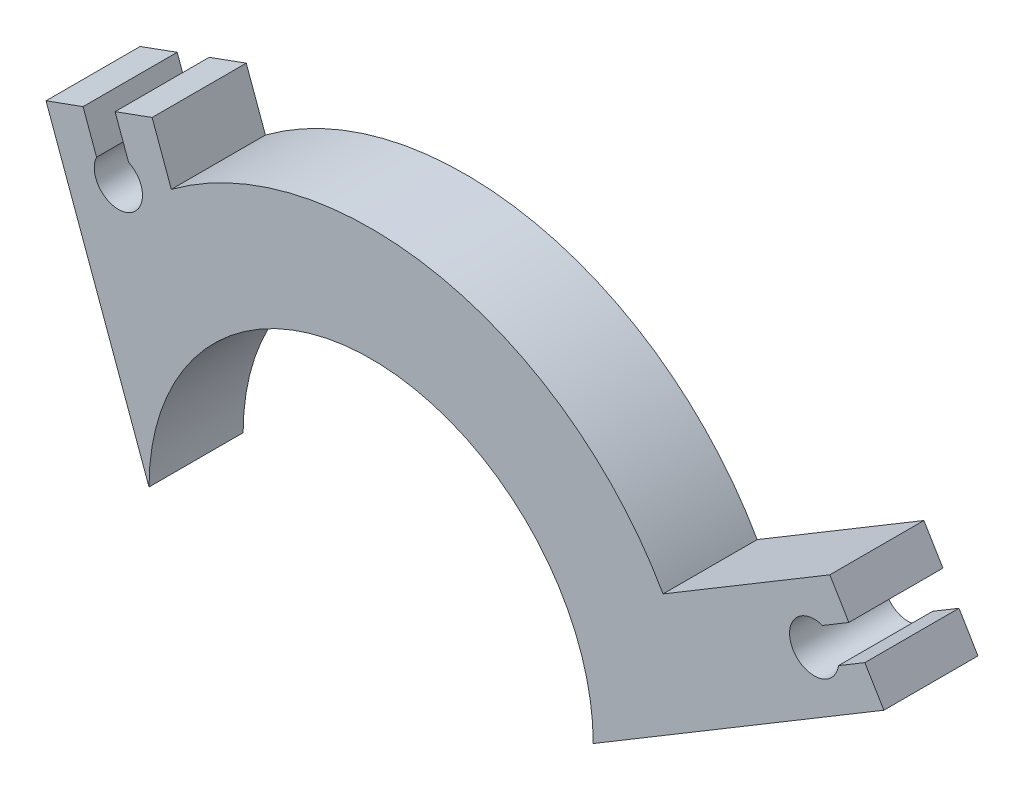
ISO-10303-21;
HEADER;
FILE_DESCRIPTION(('STEP AP214'),'2;1');
FILE_NAME('part.step','',(''),(''),'','','');
FILE_SCHEMA(('AUTOMOTIVE_DESIGN { 1 0 10303 214 1 1 1 1 }'));
ENDSEC;
DATA;
#1=APPLICATION_CONTEXT('core data for automotive mechanical design processes');
#2=APPLICATION_PROTOCOL_DEFINITION('international standard','automotive_design',2000,#1);
#3=PRODUCT_CONTEXT('',#1,'mechanical');
#4=PRODUCT('Part','Part','',(#3));
#5=PRODUCT_RELATED_PRODUCT_CATEGORY('part','',(#4));
#6=PRODUCT_DEFINITION_FORMATION('','',#4);
#7=PRODUCT_DEFINITION_CONTEXT('part definition',#1,'design');
#8=PRODUCT_DEFINITION('design','',#6,#7);
#9=PRODUCT_DEFINITION_SHAPE('','',#8);
#10=(LENGTH_UNIT() NAMED_UNIT(*) SI_UNIT(.MILLI.,.METRE.));
#11=(NAMED_UNIT(*) PLANE_ANGLE_UNIT() SI_UNIT($,.RADIAN.));
#12=(NAMED_UNIT(*) SI_UNIT($,.STERADIAN.) SOLID_ANGLE_UNIT());
#13=UNCERTAINTY_MEASURE_WITH_UNIT(LENGTH_MEASURE(1.E-05),#10,'distance_accuracy_value','');
#14=(GEOMETRIC_REPRESENTATION_CONTEXT(3) GLOBAL_UNCERTAINTY_ASSIGNED_CONTEXT((#13)) GLOBAL_UNIT_ASSIGNED_CONTEXT((#10,
#11,#12)) REPRESENTATION_CONTEXT('',''));
#15=CARTESIAN_POINT('',(0.,0.,0.));
#16=DIRECTION('',(0.,0.,1.));
#17=DIRECTION('',(1.,0.,0.));
#18=AXIS2_PLACEMENT_3D('',#15,#16,#17);
#19=CARTESIAN_POINT('',(0.,0.,1.5875));
#20=DIRECTION('',(0.,0.,-1.));
#21=DIRECTION('',(-1.,0.,0.));
#22=AXIS2_PLACEMENT_3D('',#19,#20,#21);
#23=CYLINDRICAL_SURFACE('',#22,3.7465);
#24=CARTESIAN_POINT('',(0.,0.,0.));
#25=DIRECTION('',(0.,0.,-1.));
#26=DIRECTION('',(1.,0.,0.));
#27=AXIS2_PLACEMENT_3D('',#24,#25,#26);
#28=CIRCLE('',#27,3.7465);
#29=CARTESIAN_POINT('',(-3.7465,0.,0.));
#30=VERTEX_POINT('',#29);
#31=CARTESIAN_POINT('',(3.7465,0.,0.));
#32=VERTEX_POINT('',#31);
#33=EDGE_CURVE('E176',#30,#32,#28,.T.);
#34=ORIENTED_EDGE('',*,*,#33,.T.);
#35=DIRECTION('',(0.,0.,-1.));
#36=VECTOR('',#35,1.);
#37=CARTESIAN_POINT('',(3.7465,0.,1.5875));
#38=LINE('',#37,#36);
#39=CARTESIAN_POINT('',(3.7465,0.,1.5875));
#40=VERTEX_POINT('',#39);
#41=EDGE_CURVE('E11',#40,#32,#38,.T.);
#42=ORIENTED_EDGE('',*,*,#41,.F.);
#43=CARTESIAN_POINT('',(0.,0.,1.5875));
#44=DIRECTION('',(0.,0.,-1.));
#45=DIRECTION('',(1.,0.,0.));
#46=AXIS2_PLACEMENT_3D('',#43,#44,#45);
#47=CIRCLE('',#46,3.7465);
#48=CARTESIAN_POINT('',(-3.7465,0.,1.5875));
#49=VERTEX_POINT('',#48);
#50=EDGE_CURVE('E206',#49,#40,#47,.T.);
#51=ORIENTED_EDGE('',*,*,#50,.F.);
#52=DIRECTION('',(0.,0.,-1.));
#53=VECTOR('',#52,1.);
#54=CARTESIAN_POINT('',(-3.7465,0.,1.5875));
#55=LINE('',#54,#53);
#56=EDGE_CURVE('E172',#49,#30,#55,.T.);
#57=ORIENTED_EDGE('',*,*,#56,.T.);
#58=EDGE_LOOP('',(#34,#42,#51,#57));
#59=FACE_BOUND('',#58,.T.);
#60=ADVANCED_FACE('F32',(#59),#23,.F.);
#61=CARTESIAN_POINT('',(3.7465,0.,1.5875));
#62=DIRECTION('',(-0.51400178949124,0.857789111844982,0.));
#63=DIRECTION('',(-0.857789111844982,-0.51400178949124,0.));
#64=AXIS2_PLACEMENT_3D('',#61,#62,#63);
#65=PLANE('',#64);
#66=DIRECTION('',(0.857789111844982,0.51400178949124,0.));
#67=VECTOR('',#66,1.);
#68=CARTESIAN_POINT('',(3.7465,0.,0.));
#69=LINE('',#68,#67);
#70=CARTESIAN_POINT('',(8.64876477419407,2.93752022694244,0.));
#71=VERTEX_POINT('',#70);
#72=EDGE_CURVE('E179',#32,#71,#69,.T.);
#73=ORIENTED_EDGE('',*,*,#72,.T.);
#74=DIRECTION('',(0.,0.,-1.));
#75=VECTOR('',#74,1.);
#76=CARTESIAN_POINT('',(8.64876477419407,2.93752022694244,1.5875));
#77=LINE('',#76,#75);
#78=CARTESIAN_POINT('',(8.64876477419407,2.93752022694244,1.5875));
#79=VERTEX_POINT('',#78);
#80=EDGE_CURVE('E40',#79,#71,#77,.T.);
#81=ORIENTED_EDGE('',*,*,#80,.F.);
#82=DIRECTION('',(0.857789111844982,0.51400178949124,0.));
#83=VECTOR('',#82,1.);
#84=CARTESIAN_POINT('',(3.7465,0.,1.5875));
#85=LINE('',#84,#83);
#86=EDGE_CURVE('E115',#40,#79,#85,.T.);
#87=ORIENTED_EDGE('',*,*,#86,.F.);
#88=ORIENTED_EDGE('',*,*,#41,.T.);
#89=EDGE_LOOP('',(#73,#81,#87,#88));
#90=FACE_BOUND('',#89,.T.);
#91=ADVANCED_FACE('F304',(#90),#65,.F.);
#92=CARTESIAN_POINT('',(8.64876477419407,2.93752022694244,1.5875));
#93=DIRECTION('',(-0.857789111844981,-0.514001789491241,0.));
#94=DIRECTION('',(0.514001789491241,-0.857789111844981,0.));
#95=AXIS2_PLACEMENT_3D('',#92,#93,#94);
#96=PLANE('',#95);
#97=DIRECTION('',(-0.514001789491241,0.857789111844981,0.));
#98=VECTOR('',#97,1.);
#99=CARTESIAN_POINT('',(8.64876477419407,2.93752022694244,0.));
#100=LINE('',#99,#98);
#101=CARTESIAN_POINT('',(8.32784963015071,3.4730777328006,0.));
#102=VERTEX_POINT('',#101);
#103=EDGE_CURVE('E181',#71,#102,#100,.T.);
#104=ORIENTED_EDGE('',*,*,#103,.T.);
#105=DIRECTION('',(0.,0.,-1.));
#106=VECTOR('',#105,1.);
#107=CARTESIAN_POINT('',(8.32784963015071,3.4730777328006,1.5875));
#108=LINE('',#107,#106);
#109=CARTESIAN_POINT('',(8.32784963015071,3.4730777328006,1.5875));
#110=VERTEX_POINT('',#109);
#111=EDGE_CURVE('E237',#110,#102,#108,.T.);
#112=ORIENTED_EDGE('',*,*,#111,.F.);
#113=DIRECTION('',(-0.514001789491241,0.857789111844981,0.));
#114=VECTOR('',#113,1.);
#115=CARTESIAN_POINT('',(8.64876477419407,2.93752022694244,1.5875));
#116=LINE('',#115,#114);
#117=EDGE_CURVE('E245',#79,#110,#116,.T.);
#118=ORIENTED_EDGE('',*,*,#117,.F.);
#119=ORIENTED_EDGE('',*,*,#80,.T.);
#120=EDGE_LOOP('',(#104,#112,#118,#119));
#121=FACE_BOUND('',#120,.T.);
#122=ADVANCED_FACE('F243',(#121),#96,.F.);
#123=CARTESIAN_POINT('',(8.32784963015071,3.4730777328006,1.5875));
#124=DIRECTION('',(0.514001789491243,-0.85778911184498,0.));
#125=DIRECTION('',(0.85778911184498,0.514001789491243,0.));
#126=AXIS2_PLACEMENT_3D('',#123,#124,#125);
#127=PLANE('',#126);
#128=DIRECTION('',(-0.85778911184498,-0.514001789491243,0.));
#129=VECTOR('',#128,1.);
#130=CARTESIAN_POINT('',(8.32784963015071,3.4730777328006,0.));
#131=LINE('',#130,#129);
#132=CARTESIAN_POINT('',(7.88298717588792,3.20650860245023,0.));
#133=VERTEX_POINT('',#132);
#134=EDGE_CURVE('E183',#102,#133,#131,.T.);
#135=ORIENTED_EDGE('',*,*,#134,.T.);
#136=DIRECTION('',(0.,0.,-1.));
#137=VECTOR('',#136,1.);
#138=CARTESIAN_POINT('',(7.88298717588792,3.20650860245023,1.5875));
#139=LINE('',#138,#137);
#140=CARTESIAN_POINT('',(7.88298717588792,3.20650860245023,1.5875));
#141=VERTEX_POINT('',#140);
#142=EDGE_CURVE('E234',#141,#133,#139,.T.);
#143=ORIENTED_EDGE('',*,*,#142,.F.);
#144=DIRECTION('',(-0.85778911184498,-0.514001789491243,0.));
#145=VECTOR('',#144,1.);
#146=CARTESIAN_POINT('',(8.32784963015071,3.4730777328006,1.5875));
#147=LINE('',#146,#145);
#148=EDGE_CURVE('E263',#110,#141,#147,.T.);
#149=ORIENTED_EDGE('',*,*,#148,.F.);
#150=ORIENTED_EDGE('',*,*,#111,.T.);
#151=EDGE_LOOP('',(#135,#143,#149,#150));
#152=FACE_BOUND('',#151,.T.);
#153=ADVANCED_FACE('F254',(#152),#127,.F.);
#154=CARTESIAN_POINT('',(7.47262979513493,3.26709872392423,1.5875));
#155=DIRECTION('',(0.,0.,-1.));
#156=DIRECTION('',(-1.,0.,0.));
#157=AXIS2_PLACEMENT_3D('',#154,#155,#156);
#158=CYLINDRICAL_SURFACE('',#157,0.414806391897093);
#159=CARTESIAN_POINT('',(7.47262979513493,3.26709872392423,0.));
#160=DIRECTION('',(0.,0.,-1.));
#161=DIRECTION('',(1.,0.,0.));
#162=AXIS2_PLACEMENT_3D('',#159,#160,#161);
#163=CIRCLE('',#162,0.414806391897093);
#164=CARTESIAN_POINT('',(7.61272711717027,3.65753064259536,0.));
#165=VERTEX_POINT('',#164);
#166=EDGE_CURVE('E185',#133,#165,#163,.T.);
#167=ORIENTED_EDGE('',*,*,#166,.T.);
#168=DIRECTION('',(0.,0.,-1.));
#169=VECTOR('',#168,1.);
#170=CARTESIAN_POINT('',(7.61272711717027,3.65753064259536,1.5875));
#171=LINE('',#170,#169);
#172=CARTESIAN_POINT('',(7.61272711717027,3.65753064259536,1.5875));
#173=VERTEX_POINT('',#172);
#174=EDGE_CURVE('E231',#173,#165,#171,.T.);
#175=ORIENTED_EDGE('',*,*,#174,.F.);
#176=CARTESIAN_POINT('',(7.47262979513493,3.26709872392423,1.5875));
#177=DIRECTION('',(0.,0.,-1.));
#178=DIRECTION('',(1.,0.,0.));
#179=AXIS2_PLACEMENT_3D('',#176,#177,#178);
#180=CIRCLE('',#179,0.414806391897093);
#181=EDGE_CURVE('E260',#141,#173,#180,.T.);
#182=ORIENTED_EDGE('',*,*,#181,.F.);
#183=ORIENTED_EDGE('',*,*,#142,.T.);
#184=EDGE_LOOP('',(#167,#175,#182,#183));
#185=FACE_BOUND('',#184,.T.);
#186=ADVANCED_FACE('F258',(#185),#158,.F.);
#187=CARTESIAN_POINT('',(8.05758957143306,3.92409977294573,1.5875));
#188=DIRECTION('',(-0.514001789491239,0.857789111844983,0.));
#189=DIRECTION('',(-0.857789111844983,-0.514001789491239,0.));
#190=AXIS2_PLACEMENT_3D('',#187,#188,#189);
#191=PLANE('',#190);
#192=DIRECTION('',(0.857789111844983,0.514001789491239,0.));
#193=VECTOR('',#192,1.);
#194=CARTESIAN_POINT('',(8.05758957143306,3.92409977294573,0.));
#195=LINE('',#194,#193);
#196=CARTESIAN_POINT('',(8.05758957143306,3.92409977294573,0.));
#197=VERTEX_POINT('',#196);
#198=EDGE_CURVE('E187',#165,#197,#195,.T.);
#199=ORIENTED_EDGE('',*,*,#198,.T.);
#200=DIRECTION('',(0.,0.,-1.));
#201=VECTOR('',#200,1.);
#202=CARTESIAN_POINT('',(8.05758957143306,3.92409977294573,1.5875));
#203=LINE('',#202,#201);
#204=CARTESIAN_POINT('',(8.05758957143306,3.92409977294573,1.5875));
#205=VERTEX_POINT('',#204);
#206=EDGE_CURVE('E228',#205,#197,#203,.T.);
#207=ORIENTED_EDGE('',*,*,#206,.F.);
#208=DIRECTION('',(0.857789111844983,0.514001789491239,0.));
#209=VECTOR('',#208,1.);
#210=CARTESIAN_POINT('',(8.05758957143306,3.92409977294573,1.5875));
#211=LINE('',#210,#209);
#212=EDGE_CURVE('E262',#173,#205,#211,.T.);
#213=ORIENTED_EDGE('',*,*,#212,.F.);
#214=ORIENTED_EDGE('',*,*,#174,.T.);
#215=EDGE_LOOP('',(#199,#207,#213,#214));
#216=FACE_BOUND('',#215,.T.);
#217=ADVANCED_FACE('F317',(#216),#191,.F.);
#218=CARTESIAN_POINT('',(8.05758957143306,3.92409977294573,1.5875));
#219=DIRECTION('',(-0.857789111844982,-0.514001789491241,0.));
#220=DIRECTION('',(0.514001789491241,-0.857789111844982,0.));
#221=AXIS2_PLACEMENT_3D('',#218,#219,#220);
#222=PLANE('',#221);
#223=DIRECTION('',(-0.514001789491241,0.857789111844982,0.));
#224=VECTOR('',#223,1.);
#225=CARTESIAN_POINT('',(8.05758957143306,3.92409977294573,0.));
#226=LINE('',#225,#224);
#227=CARTESIAN_POINT('',(7.73667442738969,4.4596572788039,0.));
#228=VERTEX_POINT('',#227);
#229=EDGE_CURVE('E189',#197,#228,#226,.T.);
#230=ORIENTED_EDGE('',*,*,#229,.T.);
#231=DIRECTION('',(0.,0.,-1.));
#232=VECTOR('',#231,1.);
#233=CARTESIAN_POINT('',(7.73667442738969,4.4596572788039,1.5875));
#234=LINE('',#233,#232);
#235=CARTESIAN_POINT('',(7.73667442738969,4.4596572788039,1.5875));
#236=VERTEX_POINT('',#235);
#237=EDGE_CURVE('E225',#236,#228,#234,.T.);
#238=ORIENTED_EDGE('',*,*,#237,.F.);
#239=DIRECTION('',(-0.514001789491241,0.857789111844982,0.));
#240=VECTOR('',#239,1.);
#241=CARTESIAN_POINT('',(8.05758957143306,3.92409977294573,1.5875));
#242=LINE('',#241,#240);
#243=EDGE_CURVE('E265',#205,#236,#242,.T.);
#244=ORIENTED_EDGE('',*,*,#243,.F.);
#245=ORIENTED_EDGE('',*,*,#206,.T.);
#246=EDGE_LOOP('',(#230,#238,#244,#245));
#247=FACE_BOUND('',#246,.T.);
#248=ADVANCED_FACE('F320',(#247),#222,.F.);
#249=CARTESIAN_POINT('',(7.73667442738969,4.4596572788039,1.5875));
#250=DIRECTION('',(0.514001789491241,-0.857789111844982,0.));
#251=DIRECTION('',(0.857789111844982,0.514001789491241,0.));
#252=AXIS2_PLACEMENT_3D('',#249,#250,#251);
#253=PLANE('',#252);
#254=DIRECTION('',(-0.857789111844982,-0.514001789491241,0.));
#255=VECTOR('',#254,1.);
#256=CARTESIAN_POINT('',(7.73667442738969,4.4596572788039,0.));
#257=LINE('',#256,#255);
#258=CARTESIAN_POINT('',(4.92378631338094,2.77412699604084,0.));
#259=VERTEX_POINT('',#258);
#260=EDGE_CURVE('E191',#228,#259,#257,.T.);
#261=ORIENTED_EDGE('',*,*,#260,.T.);
#262=DIRECTION('',(0.,0.,-1.));
#263=VECTOR('',#262,1.);
#264=CARTESIAN_POINT('',(4.92378631338094,2.77412699604084,1.5875));
#265=LINE('',#264,#263);
#266=CARTESIAN_POINT('',(4.92378631338094,2.77412699604084,1.5875));
#267=VERTEX_POINT('',#266);
#268=EDGE_CURVE('E222',#267,#259,#265,.T.);
#269=ORIENTED_EDGE('',*,*,#268,.F.);
#270=DIRECTION('',(-0.857789111844982,-0.514001789491241,0.));
#271=VECTOR('',#270,1.);
#272=CARTESIAN_POINT('',(7.73667442738969,4.4596572788039,1.5875));
#273=LINE('',#272,#271);
#274=EDGE_CURVE('E271',#236,#267,#273,.T.);
#275=ORIENTED_EDGE('',*,*,#274,.F.);
#276=ORIENTED_EDGE('',*,*,#237,.T.);
#277=EDGE_LOOP('',(#261,#269,#275,#276));
#278=FACE_BOUND('',#277,.T.);
#279=ADVANCED_FACE('F324',(#278),#253,.F.);
#280=CARTESIAN_POINT('',(0.,0.,1.5875));
#281=DIRECTION('',(0.,0.,-1.));
#282=DIRECTION('',(-1.,0.,0.));
#283=AXIS2_PLACEMENT_3D('',#280,#281,#282);
#284=CYLINDRICAL_SURFACE('',#283,5.6515);
#285=CARTESIAN_POINT('',(0.,0.,0.));
#286=DIRECTION('',(0.,0.,1.));
#287=DIRECTION('',(1.,0.,0.));
#288=AXIS2_PLACEMENT_3D('',#285,#286,#287);
#289=CIRCLE('',#288,5.6515);
#290=CARTESIAN_POINT('',(-3.37039470056973,4.53650656478875,0.));
#291=VERTEX_POINT('',#290);
#292=EDGE_CURVE('E193',#259,#291,#289,.T.);
#293=ORIENTED_EDGE('',*,*,#292,.T.);
#294=DIRECTION('',(0.,0.,-1.));
#295=VECTOR('',#294,1.);
#296=CARTESIAN_POINT('',(-3.37039470056973,4.53650656478875,1.5875));
#297=LINE('',#296,#295);
#298=CARTESIAN_POINT('',(-3.37039470056973,4.53650656478875,1.5875));
#299=VERTEX_POINT('',#298);
#300=EDGE_CURVE('E219',#299,#291,#297,.T.);
#301=ORIENTED_EDGE('',*,*,#300,.F.);
#302=CARTESIAN_POINT('',(0.,0.,1.5875));
#303=DIRECTION('',(0.,0.,1.));
#304=DIRECTION('',(1.,0.,0.));
#305=AXIS2_PLACEMENT_3D('',#302,#303,#304);
#306=CIRCLE('',#305,5.6515);
#307=EDGE_CURVE('E273',#267,#299,#306,.T.);
#308=ORIENTED_EDGE('',*,*,#307,.F.);
#309=ORIENTED_EDGE('',*,*,#268,.T.);
#310=EDGE_LOOP('',(#293,#301,#308,#309));
#311=FACE_BOUND('',#310,.T.);
#312=ADVANCED_FACE('F328',(#311),#284,.T.);
#313=CARTESIAN_POINT('',(-3.69384788549724,5.42518688662781,1.5875));
#314=DIRECTION('',(-0.939692620785916,-0.342020143325648,0.));
#315=DIRECTION('',(0.342020143325648,-0.939692620785916,0.));
#316=AXIS2_PLACEMENT_3D('',#313,#314,#315);
#317=PLANE('',#316);
#318=DIRECTION('',(-0.342020143325648,0.939692620785916,0.));
#319=VECTOR('',#318,1.);
#320=CARTESIAN_POINT('',(-3.69384788549724,5.42518688662781,0.));
#321=LINE('',#320,#319);
#322=CARTESIAN_POINT('',(-3.69384788549724,5.42518688662781,0.));
#323=VERTEX_POINT('',#322);
#324=EDGE_CURVE('E195',#291,#323,#321,.T.);
#325=ORIENTED_EDGE('',*,*,#324,.T.);
#326=DIRECTION('',(0.,0.,-1.));
#327=VECTOR('',#326,1.);
#328=CARTESIAN_POINT('',(-3.69384788549724,5.42518688662781,1.5875));
#329=LINE('',#328,#327);
#330=CARTESIAN_POINT('',(-3.69384788549724,5.42518688662781,1.5875));
#331=VERTEX_POINT('',#330);
#332=EDGE_CURVE('E216',#331,#323,#329,.T.);
#333=ORIENTED_EDGE('',*,*,#332,.F.);
#334=DIRECTION('',(-0.342020143325648,0.939692620785916,0.));
#335=VECTOR('',#334,1.);
#336=CARTESIAN_POINT('',(-3.69384788549724,5.42518688662781,1.5875));
#337=LINE('',#336,#335);
#338=EDGE_CURVE('E275',#299,#331,#337,.T.);
#339=ORIENTED_EDGE('',*,*,#338,.F.);
#340=ORIENTED_EDGE('',*,*,#300,.T.);
#341=EDGE_LOOP('',(#325,#333,#339,#340));
#342=FACE_BOUND('',#341,.T.);
#343=ADVANCED_FACE('F332',(#342),#317,.F.);
#344=CARTESIAN_POINT('',(-4.31886733368426,5.19769841165025,1.5875));
#345=DIRECTION('',(0.342020143325667,-0.939692620785909,0.));
#346=DIRECTION('',(0.939692620785909,0.342020143325667,0.));
#347=AXIS2_PLACEMENT_3D('',#344,#345,#346);
#348=PLANE('',#347);
#349=DIRECTION('',(-0.939692620785909,-0.342020143325667,0.));
#350=VECTOR('',#349,1.);
#351=CARTESIAN_POINT('',(-4.31886733368426,5.19769841165025,0.));
#352=LINE('',#351,#350);
#353=CARTESIAN_POINT('',(-4.31886733368426,5.19769841165025,0.));
#354=VERTEX_POINT('',#353);
#355=EDGE_CURVE('E197',#323,#354,#352,.T.);
#356=ORIENTED_EDGE('',*,*,#355,.T.);
#357=DIRECTION('',(0.,0.,-1.));
#358=VECTOR('',#357,1.);
#359=CARTESIAN_POINT('',(-4.31886733368426,5.19769841165025,1.5875));
#360=LINE('',#359,#358);
#361=CARTESIAN_POINT('',(-4.31886733368426,5.19769841165025,1.5875));
#362=VERTEX_POINT('',#361);
#363=EDGE_CURVE('E213',#362,#354,#360,.T.);
#364=ORIENTED_EDGE('',*,*,#363,.F.);
#365=DIRECTION('',(-0.939692620785909,-0.342020143325667,0.));
#366=VECTOR('',#365,1.);
#367=CARTESIAN_POINT('',(-4.31886733368426,5.19769841165025,1.5875));
#368=LINE('',#367,#366);
#369=EDGE_CURVE('E277',#331,#362,#368,.T.);
#370=ORIENTED_EDGE('',*,*,#369,.F.);
#371=ORIENTED_EDGE('',*,*,#332,.T.);
#372=EDGE_LOOP('',(#356,#364,#370,#371));
#373=FACE_BOUND('',#372,.T.);
#374=ADVANCED_FACE('F336',(#373),#348,.F.);
#375=CARTESIAN_POINT('',(-4.31886733368426,5.19769841165025,1.5875));
#376=DIRECTION('',(0.939692620785909,0.342020143325667,0.));
#377=DIRECTION('',(-0.342020143325667,0.939692620785909,0.));
#378=AXIS2_PLACEMENT_3D('',#375,#376,#377);
#379=PLANE('',#378);
#380=DIRECTION('',(0.342020143325668,-0.939692620785909,0.));
#381=VECTOR('',#380,1.);
#382=CARTESIAN_POINT('',(-4.31886733368426,5.19769841165025,0.));
#383=LINE('',#382,#381);
#384=CARTESIAN_POINT('',(-4.0913788587067,4.57267896346323,0.));
#385=VERTEX_POINT('',#384);
#386=EDGE_CURVE('E199',#354,#385,#383,.T.);
#387=ORIENTED_EDGE('',*,*,#386,.T.);
#388=DIRECTION('',(0.,0.,-1.));
#389=VECTOR('',#388,1.);
#390=CARTESIAN_POINT('',(-4.0913788587067,4.57267896346323,1.5875));
#391=LINE('',#390,#389);
#392=CARTESIAN_POINT('',(-4.0913788587067,4.57267896346323,1.5875));
#393=VERTEX_POINT('',#392);
#394=EDGE_CURVE('E210',#393,#385,#391,.T.);
#395=ORIENTED_EDGE('',*,*,#394,.F.);
#396=DIRECTION('',(0.342020143325668,-0.939692620785909,0.));
#397=VECTOR('',#396,1.);
#398=CARTESIAN_POINT('',(-4.31886733368426,5.19769841165025,1.5875));
#399=LINE('',#398,#397);
#400=EDGE_CURVE('E279',#362,#393,#399,.T.);
#401=ORIENTED_EDGE('',*,*,#400,.F.);
#402=ORIENTED_EDGE('',*,*,#363,.T.);
#403=EDGE_LOOP('',(#387,#395,#401,#402));
#404=FACE_BOUND('',#403,.T.);
#405=ADVANCED_FACE('F285',(#404),#379,.F.);
#406=CARTESIAN_POINT('',(-4.26313092027811,4.20435547881154,1.5875));
#407=DIRECTION('',(0.,0.,-1.));
#408=DIRECTION('',(-1.,0.,0.));
#409=AXIS2_PLACEMENT_3D('',#406,#407,#408);
#410=CYLINDRICAL_SURFACE('',#409,0.4064);
#411=CARTESIAN_POINT('',(-4.26313092027811,4.20435547881154,0.));
#412=DIRECTION('',(0.,0.,-1.));
#413=DIRECTION('',(1.,0.,0.));
#414=AXIS2_PLACEMENT_3D('',#411,#412,#413);
#415=CIRCLE('',#414,0.4064);
#416=CARTESIAN_POINT('',(-4.63145440492981,4.37610754038296,0.));
#417=VERTEX_POINT('',#416);
#418=EDGE_CURVE('E201',#385,#417,#415,.T.);
#419=ORIENTED_EDGE('',*,*,#418,.T.);
#420=DIRECTION('',(0.,0.,-1.));
#421=VECTOR('',#420,1.);
#422=CARTESIAN_POINT('',(-4.63145440492981,4.37610754038296,1.5875));
#423=LINE('',#422,#421);
#424=CARTESIAN_POINT('',(-4.63145440492981,4.37610754038296,1.5875));
#425=VERTEX_POINT('',#424);
#426=EDGE_CURVE('E167',#425,#417,#423,.T.);
#427=ORIENTED_EDGE('',*,*,#426,.F.);
#428=CARTESIAN_POINT('',(-4.26313092027811,4.20435547881154,1.5875));
#429=DIRECTION('',(0.,0.,-1.));
#430=DIRECTION('',(1.,0.,0.));
#431=AXIS2_PLACEMENT_3D('',#428,#429,#430);
#432=CIRCLE('',#431,0.4064);
#433=EDGE_CURVE('E158',#393,#425,#432,.T.);
#434=ORIENTED_EDGE('',*,*,#433,.F.);
#435=ORIENTED_EDGE('',*,*,#394,.T.);
#436=EDGE_LOOP('',(#419,#427,#434,#435));
#437=FACE_BOUND('',#436,.T.);
#438=ADVANCED_FACE('F289',(#437),#410,.F.);
#439=CARTESIAN_POINT('',(-4.85894287990737,5.00112698856998,1.5875));
#440=DIRECTION('',(-0.939692620785909,-0.342020143325668,0.));
#441=DIRECTION('',(0.342020143325668,-0.939692620785909,0.));
#442=AXIS2_PLACEMENT_3D('',#439,#440,#441);
#443=PLANE('',#442);
#444=DIRECTION('',(-0.342020143325668,0.939692620785909,0.));
#445=VECTOR('',#444,1.);
#446=CARTESIAN_POINT('',(-4.85894287990737,5.00112698856998,0.));
#447=LINE('',#446,#445);
#448=CARTESIAN_POINT('',(-4.85894287990737,5.00112698856998,0.));
#449=VERTEX_POINT('',#448);
#450=EDGE_CURVE('E166',#417,#449,#447,.T.);
#451=ORIENTED_EDGE('',*,*,#450,.T.);
#452=DIRECTION('',(0.,0.,-1.));
#453=VECTOR('',#452,1.);
#454=CARTESIAN_POINT('',(-4.85894287990737,5.00112698856998,1.5875));
#455=LINE('',#454,#453);
#456=CARTESIAN_POINT('',(-4.85894287990737,5.00112698856998,1.5875));
#457=VERTEX_POINT('',#456);
#458=EDGE_CURVE('E163',#457,#449,#455,.T.);
#459=ORIENTED_EDGE('',*,*,#458,.F.);
#460=DIRECTION('',(-0.342020143325668,0.939692620785909,0.));
#461=VECTOR('',#460,1.);
#462=CARTESIAN_POINT('',(-4.85894287990737,5.00112698856998,1.5875));
#463=LINE('',#462,#461);
#464=EDGE_CURVE('E152',#425,#457,#463,.T.);
#465=ORIENTED_EDGE('',*,*,#464,.F.);
#466=ORIENTED_EDGE('',*,*,#426,.T.);
#467=EDGE_LOOP('',(#451,#459,#465,#466));
#468=FACE_BOUND('',#467,.T.);
#469=ADVANCED_FACE('F164',(#468),#443,.F.);
#470=CARTESIAN_POINT('',(-5.48396232809439,4.77363851359242,1.5875));
#471=DIRECTION('',(0.342020143325667,-0.939692620785909,0.));
#472=DIRECTION('',(0.939692620785909,0.342020143325667,0.));
#473=AXIS2_PLACEMENT_3D('',#470,#471,#472);
#474=PLANE('',#473);
#475=DIRECTION('',(-0.939692620785909,-0.342020143325667,0.));
#476=VECTOR('',#475,1.);
#477=CARTESIAN_POINT('',(-5.48396232809439,4.77363851359242,0.));
#478=LINE('',#477,#476);
#479=CARTESIAN_POINT('',(-5.48396232809439,4.77363851359242,0.));
#480=VERTEX_POINT('',#479);
#481=EDGE_CURVE('E101',#449,#480,#478,.T.);
#482=ORIENTED_EDGE('',*,*,#481,.T.);
#483=DIRECTION('',(0.,0.,-1.));
#484=VECTOR('',#483,1.);
#485=CARTESIAN_POINT('',(-5.48396232809439,4.77363851359242,1.5875));
#486=LINE('',#485,#484);
#487=CARTESIAN_POINT('',(-5.48396232809439,4.77363851359242,1.5875));
#488=VERTEX_POINT('',#487);
#489=EDGE_CURVE('E168',#488,#480,#486,.T.);
#490=ORIENTED_EDGE('',*,*,#489,.F.);
#491=DIRECTION('',(-0.939692620785909,-0.342020143325667,0.));
#492=VECTOR('',#491,1.);
#493=CARTESIAN_POINT('',(-5.48396232809439,4.77363851359242,1.5875));
#494=LINE('',#493,#492);
#495=EDGE_CURVE('E156',#457,#488,#494,.T.);
#496=ORIENTED_EDGE('',*,*,#495,.F.);
#497=ORIENTED_EDGE('',*,*,#458,.T.);
#498=EDGE_LOOP('',(#482,#490,#496,#497));
#499=FACE_BOUND('',#498,.T.);
#500=ADVANCED_FACE('F170',(#499),#474,.F.);
#501=CARTESIAN_POINT('',(-3.7465,0.,1.5875));
#502=DIRECTION('',(0.939692620785909,0.342020143325668,0.));
#503=DIRECTION('',(-0.342020143325668,0.939692620785909,0.));
#504=AXIS2_PLACEMENT_3D('',#501,#502,#503);
#505=PLANE('',#504);
#506=DIRECTION('',(0.342020143325668,-0.939692620785909,0.));
#507=VECTOR('',#506,1.);
#508=CARTESIAN_POINT('',(-3.7465,0.,0.));
#509=LINE('',#508,#507);
#510=EDGE_CURVE('E107',#480,#30,#509,.T.);
#511=ORIENTED_EDGE('',*,*,#510,.T.);
#512=ORIENTED_EDGE('',*,*,#56,.F.);
#513=DIRECTION('',(0.342020143325668,-0.939692620785909,0.));
#514=VECTOR('',#513,1.);
#515=CARTESIAN_POINT('',(-3.7465,0.,1.5875));
#516=LINE('',#515,#514);
#517=EDGE_CURVE('E48',#488,#49,#516,.T.);
#518=ORIENTED_EDGE('',*,*,#517,.F.);
#519=ORIENTED_EDGE('',*,*,#489,.T.);
#520=EDGE_LOOP('',(#511,#512,#518,#519));
#521=FACE_BOUND('',#520,.T.);
#522=ADVANCED_FACE('F293',(#521),#505,.F.);
#523=CARTESIAN_POINT('',(0.,0.,1.5875));
#524=DIRECTION('',(0.,0.,1.));
#525=DIRECTION('',(1.,0.,0.));
#526=AXIS2_PLACEMENT_3D('',#523,#524,#525);
#527=PLANE('',#526);
#528=ORIENTED_EDGE('',*,*,#50,.T.);
#529=ORIENTED_EDGE('',*,*,#86,.T.);
#530=ORIENTED_EDGE('',*,*,#117,.T.);
#531=ORIENTED_EDGE('',*,*,#148,.T.);
#532=ORIENTED_EDGE('',*,*,#181,.T.);
#533=ORIENTED_EDGE('',*,*,#212,.T.);
#534=ORIENTED_EDGE('',*,*,#243,.T.);
#535=ORIENTED_EDGE('',*,*,#274,.T.);
#536=ORIENTED_EDGE('',*,*,#307,.T.);
#537=ORIENTED_EDGE('',*,*,#338,.T.);
#538=ORIENTED_EDGE('',*,*,#369,.T.);
#539=ORIENTED_EDGE('',*,*,#400,.T.);
#540=ORIENTED_EDGE('',*,*,#433,.T.);
#541=ORIENTED_EDGE('',*,*,#464,.T.);
#542=ORIENTED_EDGE('',*,*,#495,.T.);
#543=ORIENTED_EDGE('',*,*,#517,.T.);
#544=EDGE_LOOP('',(#528,#529,#530,#531,#532,#533,#534,#535,#536,#537,#538,#539,#540,#541,#542,#543));
#545=FACE_BOUND('',#544,.T.);
#546=ADVANCED_FACE('F154',(#545),#527,.T.);
#547=CARTESIAN_POINT('',(0.,0.,0.));
#548=DIRECTION('',(0.,0.,1.));
#549=DIRECTION('',(1.,0.,0.));
#550=AXIS2_PLACEMENT_3D('',#547,#548,#549);
#551=PLANE('',#550);
#552=ORIENTED_EDGE('',*,*,#33,.F.);
#553=ORIENTED_EDGE('',*,*,#510,.F.);
#554=ORIENTED_EDGE('',*,*,#481,.F.);
#555=ORIENTED_EDGE('',*,*,#450,.F.);
#556=ORIENTED_EDGE('',*,*,#418,.F.);
#557=ORIENTED_EDGE('',*,*,#386,.F.);
#558=ORIENTED_EDGE('',*,*,#355,.F.);
#559=ORIENTED_EDGE('',*,*,#324,.F.);
#560=ORIENTED_EDGE('',*,*,#292,.F.);
#561=ORIENTED_EDGE('',*,*,#260,.F.);
#562=ORIENTED_EDGE('',*,*,#229,.F.);
#563=ORIENTED_EDGE('',*,*,#198,.F.);
#564=ORIENTED_EDGE('',*,*,#166,.F.);
#565=ORIENTED_EDGE('',*,*,#134,.F.);
#566=ORIENTED_EDGE('',*,*,#103,.F.);
#567=ORIENTED_EDGE('',*,*,#72,.F.);
#568=EDGE_LOOP('',(#552,#553,#554,#555,#556,#557,#558,#559,#560,#561,#562,#563,#564,#565,#566,#567));
#569=FACE_BOUND('',#568,.T.);
#570=ADVANCED_FACE('F249',(#569),#551,.F.);
#571=CLOSED_SHELL('',(#60,#91,#122,#153,#186,#217,#248,#279,#312,#343,#374,#405,#438,#469,#500,
#522,#546,#570));
#572=MANIFOLD_SOLID_BREP('B2',#571);
#573=ADVANCED_BREP_SHAPE_REPRESENTATION('',(#18,#572),#14);
#574=SHAPE_DEFINITION_REPRESENTATION(#9,#573);
ENDSEC;
END-ISO-10303-21;
